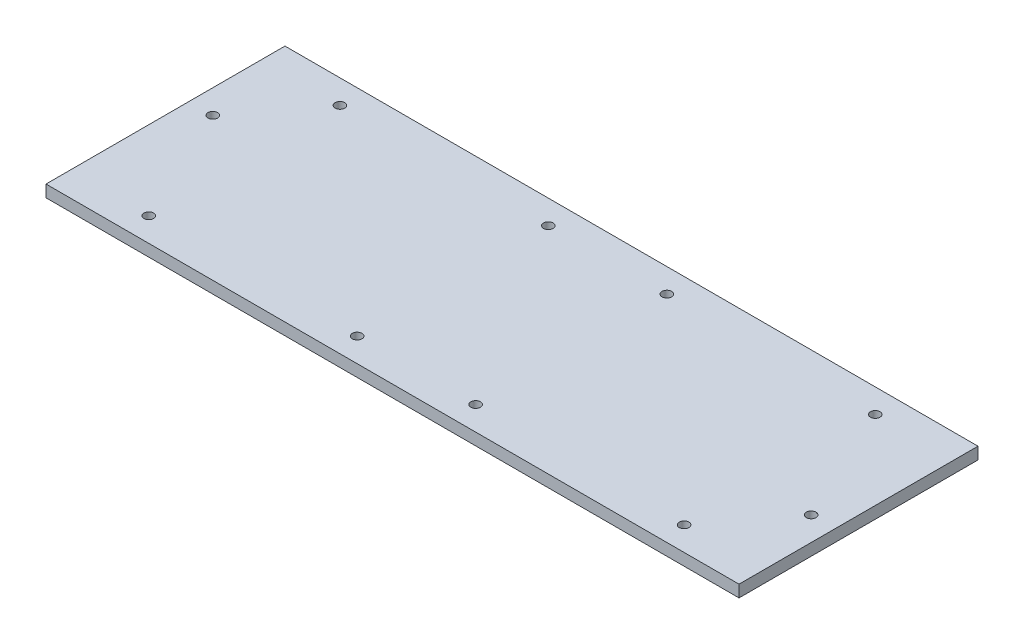
ISO-10303-21;
HEADER;
FILE_DESCRIPTION(('STEP AP214'),'2;1');
FILE_NAME('part.step','',(''),(''),'','','');
FILE_SCHEMA(('AUTOMOTIVE_DESIGN { 1 0 10303 214 1 1 1 1 }'));
ENDSEC;
DATA;
#1=APPLICATION_CONTEXT('core data for automotive mechanical design processes');
#2=APPLICATION_PROTOCOL_DEFINITION('international standard','automotive_design',2000,#1);
#3=PRODUCT_CONTEXT('',#1,'mechanical');
#4=PRODUCT('Part','Part','',(#3));
#5=PRODUCT_RELATED_PRODUCT_CATEGORY('part','',(#4));
#6=PRODUCT_DEFINITION_FORMATION('','',#4);
#7=PRODUCT_DEFINITION_CONTEXT('part definition',#1,'design');
#8=PRODUCT_DEFINITION('design','',#6,#7);
#9=PRODUCT_DEFINITION_SHAPE('','',#8);
#10=(LENGTH_UNIT() NAMED_UNIT(*) SI_UNIT(.MILLI.,.METRE.));
#11=(NAMED_UNIT(*) PLANE_ANGLE_UNIT() SI_UNIT($,.RADIAN.));
#12=(NAMED_UNIT(*) SI_UNIT($,.STERADIAN.) SOLID_ANGLE_UNIT());
#13=UNCERTAINTY_MEASURE_WITH_UNIT(LENGTH_MEASURE(1.E-05),#10,'distance_accuracy_value','');
#14=(GEOMETRIC_REPRESENTATION_CONTEXT(3) GLOBAL_UNCERTAINTY_ASSIGNED_CONTEXT((#13)) GLOBAL_UNIT_ASSIGNED_CONTEXT((#10,
#11,#12)) REPRESENTATION_CONTEXT('',''));
#15=CARTESIAN_POINT('',(0.,0.,0.));
#16=DIRECTION('',(0.,0.,1.));
#17=DIRECTION('',(1.,0.,0.));
#18=AXIS2_PLACEMENT_3D('',#15,#16,#17);
#19=CARTESIAN_POINT('',(0.,6.35,0.));
#20=DIRECTION('',(0.,-1.,0.));
#21=DIRECTION('',(0.,0.,-1.));
#22=AXIS2_PLACEMENT_3D('',#19,#20,#21);
#23=PLANE('',#22);
#24=DIRECTION('',(0.,0.,-1.));
#25=VECTOR('',#24,1.);
#26=CARTESIAN_POINT('',(368.3,6.35,-127.000000000001));
#27=LINE('',#26,#25);
#28=CARTESIAN_POINT('',(368.3,6.35,-1.27675647831893E-12));
#29=VERTEX_POINT('',#28);
#30=CARTESIAN_POINT('',(368.3,6.35,-127.000000000001));
#31=VERTEX_POINT('',#30);
#32=EDGE_CURVE('E87',#29,#31,#27,.T.);
#33=ORIENTED_EDGE('',*,*,#32,.T.);
#34=DIRECTION('',(-1.,0.,0.));
#35=VECTOR('',#34,1.);
#36=CARTESIAN_POINT('',(368.3,6.35,-127.000000000001));
#37=LINE('',#36,#35);
#38=CARTESIAN_POINT('',(-4.44089209850054E-13,6.35,-127.000000000001));
#39=VERTEX_POINT('',#38);
#40=EDGE_CURVE('E82',#31,#39,#37,.T.);
#41=ORIENTED_EDGE('',*,*,#40,.T.);
#42=DIRECTION('',(0.,0.,1.));
#43=VECTOR('',#42,1.);
#44=CARTESIAN_POINT('',(-4.44089209850054E-13,6.35,-127.000000000001));
#45=LINE('',#44,#43);
#46=CARTESIAN_POINT('',(4.44089209850063E-13,6.35,1.30451205393456E-12));
#47=VERTEX_POINT('',#46);
#48=EDGE_CURVE('E85',#39,#47,#45,.T.);
#49=ORIENTED_EDGE('',*,*,#48,.T.);
#50=DIRECTION('',(1.,0.,0.));
#51=VECTOR('',#50,1.);
#52=CARTESIAN_POINT('',(368.3,6.35,-1.27675647831893E-12));
#53=LINE('',#52,#51);
#54=EDGE_CURVE('E52',#47,#29,#53,.T.);
#55=ORIENTED_EDGE('',*,*,#54,.T.);
#56=EDGE_LOOP('',(#33,#41,#49,#55));
#57=FACE_BOUND('',#56,.T.);
#58=CARTESIAN_POINT('',(326.39,6.35,-12.700000000001));
#59=DIRECTION('',(0.,1.,0.));
#60=DIRECTION('',(0.,0.,1.));
#61=AXIS2_PLACEMENT_3D('',#58,#59,#60);
#62=CIRCLE('',#61,2.5527);
#63=CARTESIAN_POINT('',(326.39,6.35,-10.147300000001));
#64=VERTEX_POINT('',#63);
#65=EDGE_CURVE('E102',#64,#64,#62,.T.);
#66=ORIENTED_EDGE('',*,*,#65,.F.);
#67=EDGE_LOOP('',(#66));
#68=FACE_BOUND('',#67,.T.);
#69=CARTESIAN_POINT('',(41.9100000000004,6.35,-12.699999999999));
#70=DIRECTION('',(0.,1.,0.));
#71=DIRECTION('',(0.,0.,1.));
#72=AXIS2_PLACEMENT_3D('',#69,#70,#71);
#73=CIRCLE('',#72,2.5527);
#74=CARTESIAN_POINT('',(41.9100000000004,6.35,-10.147299999999));
#75=VERTEX_POINT('',#74);
#76=EDGE_CURVE('E117',#75,#75,#73,.T.);
#77=ORIENTED_EDGE('',*,*,#76,.F.);
#78=EDGE_LOOP('',(#77));
#79=FACE_BOUND('',#78,.T.);
#80=CARTESIAN_POINT('',(215.646,6.35,-12.7000000000002));
#81=DIRECTION('',(0.,1.,0.));
#82=DIRECTION('',(0.,0.,1.));
#83=AXIS2_PLACEMENT_3D('',#80,#81,#82);
#84=CIRCLE('',#83,2.55270000000002);
#85=CARTESIAN_POINT('',(215.646,6.35,-10.1473000000002));
#86=VERTEX_POINT('',#85);
#87=EDGE_CURVE('E123',#86,#86,#84,.T.);
#88=ORIENTED_EDGE('',*,*,#87,.F.);
#89=EDGE_LOOP('',(#88));
#90=FACE_BOUND('',#89,.T.);
#91=CARTESIAN_POINT('',(152.654,6.35,-12.6999999999998));
#92=DIRECTION('',(0.,1.,0.));
#93=DIRECTION('',(0.,0.,1.));
#94=AXIS2_PLACEMENT_3D('',#91,#92,#93);
#95=CIRCLE('',#94,2.55270000000005);
#96=CARTESIAN_POINT('',(152.654,6.35,-10.1472999999997));
#97=VERTEX_POINT('',#96);
#98=EDGE_CURVE('E129',#97,#97,#95,.T.);
#99=ORIENTED_EDGE('',*,*,#98,.F.);
#100=EDGE_LOOP('',(#99));
#101=FACE_BOUND('',#100,.T.);
#102=CARTESIAN_POINT('',(215.646,6.35,-114.300000000001));
#103=DIRECTION('',(0.,1.,0.));
#104=DIRECTION('',(0.,0.,1.));
#105=AXIS2_PLACEMENT_3D('',#102,#103,#104);
#106=CIRCLE('',#105,2.55270000000075);
#107=CARTESIAN_POINT('',(215.646,6.35,-111.747300000001));
#108=VERTEX_POINT('',#107);
#109=EDGE_CURVE('E135',#108,#108,#106,.T.);
#110=ORIENTED_EDGE('',*,*,#109,.F.);
#111=EDGE_LOOP('',(#110));
#112=FACE_BOUND('',#111,.T.);
#113=CARTESIAN_POINT('',(41.9099999999996,6.35,-114.3));
#114=DIRECTION('',(0.,1.,0.));
#115=DIRECTION('',(0.,0.,1.));
#116=AXIS2_PLACEMENT_3D('',#113,#114,#115);
#117=CIRCLE('',#116,2.5527000000003);
#118=CARTESIAN_POINT('',(41.9099999999996,6.35,-111.7473));
#119=VERTEX_POINT('',#118);
#120=EDGE_CURVE('E141',#119,#119,#117,.T.);
#121=ORIENTED_EDGE('',*,*,#120,.F.);
#122=EDGE_LOOP('',(#121));
#123=FACE_BOUND('',#122,.T.);
#124=CARTESIAN_POINT('',(326.39,6.35,-114.300000000002));
#125=DIRECTION('',(0.,1.,0.));
#126=DIRECTION('',(0.,0.,1.));
#127=AXIS2_PLACEMENT_3D('',#124,#125,#126);
#128=CIRCLE('',#127,2.55270000000072);
#129=CARTESIAN_POINT('',(326.39,6.35,-111.747300000002));
#130=VERTEX_POINT('',#129);
#131=EDGE_CURVE('E147',#130,#130,#128,.T.);
#132=ORIENTED_EDGE('',*,*,#131,.F.);
#133=EDGE_LOOP('',(#132));
#134=FACE_BOUND('',#133,.T.);
#135=CARTESIAN_POINT('',(152.654,6.35,-114.300000000001));
#136=DIRECTION('',(0.,1.,0.));
#137=DIRECTION('',(0.,0.,1.));
#138=AXIS2_PLACEMENT_3D('',#135,#136,#137);
#139=CIRCLE('',#138,2.5527000000004);
#140=CARTESIAN_POINT('',(152.654,6.35,-111.747300000001));
#141=VERTEX_POINT('',#140);
#142=EDGE_CURVE('E153',#141,#141,#139,.T.);
#143=ORIENTED_EDGE('',*,*,#142,.F.);
#144=EDGE_LOOP('',(#143));
#145=FACE_BOUND('',#144,.T.);
#146=CARTESIAN_POINT('',(12.7000000000001,6.35,-75.9460000000007));
#147=DIRECTION('',(0.,1.,0.));
#148=DIRECTION('',(0.,0.,1.));
#149=AXIS2_PLACEMENT_3D('',#146,#147,#148);
#150=CIRCLE('',#149,2.55270000000064);
#151=CARTESIAN_POINT('',(12.7000000000001,6.35,-73.3933));
#152=VERTEX_POINT('',#151);
#153=EDGE_CURVE('E159',#152,#152,#150,.T.);
#154=ORIENTED_EDGE('',*,*,#153,.F.);
#155=EDGE_LOOP('',(#154));
#156=FACE_BOUND('',#155,.T.);
#157=CARTESIAN_POINT('',(355.6,6.35,-51.0540000000012));
#158=DIRECTION('',(0.,1.,0.));
#159=DIRECTION('',(0.,0.,1.));
#160=AXIS2_PLACEMENT_3D('',#157,#158,#159);
#161=CIRCLE('',#160,2.55270000000021);
#162=CARTESIAN_POINT('',(355.6,6.35,-48.501300000001));
#163=VERTEX_POINT('',#162);
#164=EDGE_CURVE('E165',#163,#163,#161,.T.);
#165=ORIENTED_EDGE('',*,*,#164,.F.);
#166=EDGE_LOOP('',(#165));
#167=FACE_BOUND('',#166,.T.);
#168=ADVANCED_FACE('F35',(#57,#68,#79,#90,#101,#112,#123,#134,#145,#156,#167),#23,.F.);
#169=CARTESIAN_POINT('',(0.,0.,0.));
#170=DIRECTION('',(0.,-1.,0.));
#171=DIRECTION('',(0.,0.,-1.));
#172=AXIS2_PLACEMENT_3D('',#169,#170,#171);
#173=PLANE('',#172);
#174=CARTESIAN_POINT('',(12.7000000000001,0.,-75.9460000000007));
#175=DIRECTION('',(0.,1.,0.));
#176=DIRECTION('',(0.,0.,1.));
#177=AXIS2_PLACEMENT_3D('',#174,#175,#176);
#178=CIRCLE('',#177,2.55270000000064);
#179=CARTESIAN_POINT('',(12.7000000000001,0.,-73.3933));
#180=VERTEX_POINT('',#179);
#181=EDGE_CURVE('E162',#180,#180,#178,.T.);
#182=ORIENTED_EDGE('',*,*,#181,.T.);
#183=EDGE_LOOP('',(#182));
#184=FACE_BOUND('',#183,.T.);
#185=CARTESIAN_POINT('',(326.39,0.,-114.300000000002));
#186=DIRECTION('',(0.,1.,0.));
#187=DIRECTION('',(0.,0.,1.));
#188=AXIS2_PLACEMENT_3D('',#185,#186,#187);
#189=CIRCLE('',#188,2.55270000000072);
#190=CARTESIAN_POINT('',(326.39,0.,-111.747300000002));
#191=VERTEX_POINT('',#190);
#192=EDGE_CURVE('E150',#191,#191,#189,.T.);
#193=ORIENTED_EDGE('',*,*,#192,.T.);
#194=EDGE_LOOP('',(#193));
#195=FACE_BOUND('',#194,.T.);
#196=CARTESIAN_POINT('',(215.646,0.,-114.300000000001));
#197=DIRECTION('',(0.,1.,0.));
#198=DIRECTION('',(0.,0.,1.));
#199=AXIS2_PLACEMENT_3D('',#196,#197,#198);
#200=CIRCLE('',#199,2.55270000000075);
#201=CARTESIAN_POINT('',(215.646,0.,-111.747300000001));
#202=VERTEX_POINT('',#201);
#203=EDGE_CURVE('E138',#202,#202,#200,.T.);
#204=ORIENTED_EDGE('',*,*,#203,.T.);
#205=EDGE_LOOP('',(#204));
#206=FACE_BOUND('',#205,.T.);
#207=CARTESIAN_POINT('',(215.646,0.,-12.7000000000002));
#208=DIRECTION('',(0.,1.,0.));
#209=DIRECTION('',(0.,0.,1.));
#210=AXIS2_PLACEMENT_3D('',#207,#208,#209);
#211=CIRCLE('',#210,2.55270000000002);
#212=CARTESIAN_POINT('',(215.646,0.,-10.1473000000002));
#213=VERTEX_POINT('',#212);
#214=EDGE_CURVE('E126',#213,#213,#211,.T.);
#215=ORIENTED_EDGE('',*,*,#214,.T.);
#216=EDGE_LOOP('',(#215));
#217=FACE_BOUND('',#216,.T.);
#218=CARTESIAN_POINT('',(326.39,0.,-12.700000000001));
#219=DIRECTION('',(0.,1.,0.));
#220=DIRECTION('',(0.,0.,1.));
#221=AXIS2_PLACEMENT_3D('',#218,#219,#220);
#222=CIRCLE('',#221,2.5527);
#223=CARTESIAN_POINT('',(326.39,0.,-10.147300000001));
#224=VERTEX_POINT('',#223);
#225=EDGE_CURVE('E114',#224,#224,#222,.T.);
#226=ORIENTED_EDGE('',*,*,#225,.T.);
#227=EDGE_LOOP('',(#226));
#228=FACE_BOUND('',#227,.T.);
#229=DIRECTION('',(0.,0.,-1.));
#230=VECTOR('',#229,1.);
#231=CARTESIAN_POINT('',(368.3,0.,-127.000000000001));
#232=LINE('',#231,#230);
#233=CARTESIAN_POINT('',(368.3,0.,-1.27675647831893E-12));
#234=VERTEX_POINT('',#233);
#235=CARTESIAN_POINT('',(368.3,0.,-127.000000000001));
#236=VERTEX_POINT('',#235);
#237=EDGE_CURVE('E99',#234,#236,#232,.T.);
#238=ORIENTED_EDGE('',*,*,#237,.F.);
#239=DIRECTION('',(1.,0.,0.));
#240=VECTOR('',#239,1.);
#241=CARTESIAN_POINT('',(368.3,0.,-1.27675647831893E-12));
#242=LINE('',#241,#240);
#243=CARTESIAN_POINT('',(4.44089209850063E-13,0.,1.30451205393456E-12));
#244=VERTEX_POINT('',#243);
#245=EDGE_CURVE('E75',#244,#234,#242,.T.);
#246=ORIENTED_EDGE('',*,*,#245,.F.);
#247=DIRECTION('',(0.,0.,1.));
#248=VECTOR('',#247,1.);
#249=CARTESIAN_POINT('',(-4.44089209850054E-13,0.,-127.000000000001));
#250=LINE('',#249,#248);
#251=CARTESIAN_POINT('',(-4.44089209850054E-13,0.,-127.000000000001));
#252=VERTEX_POINT('',#251);
#253=EDGE_CURVE('E69',#252,#244,#250,.T.);
#254=ORIENTED_EDGE('',*,*,#253,.F.);
#255=DIRECTION('',(-1.,0.,0.));
#256=VECTOR('',#255,1.);
#257=CARTESIAN_POINT('',(368.3,0.,-127.000000000001));
#258=LINE('',#257,#256);
#259=EDGE_CURVE('E91',#236,#252,#258,.T.);
#260=ORIENTED_EDGE('',*,*,#259,.F.);
#261=EDGE_LOOP('',(#238,#246,#254,#260));
#262=FACE_BOUND('',#261,.T.);
#263=CARTESIAN_POINT('',(41.9100000000004,0.,-12.699999999999));
#264=DIRECTION('',(0.,1.,0.));
#265=DIRECTION('',(0.,0.,1.));
#266=AXIS2_PLACEMENT_3D('',#263,#264,#265);
#267=CIRCLE('',#266,2.5527);
#268=CARTESIAN_POINT('',(41.9100000000004,0.,-10.147299999999));
#269=VERTEX_POINT('',#268);
#270=EDGE_CURVE('E120',#269,#269,#267,.T.);
#271=ORIENTED_EDGE('',*,*,#270,.T.);
#272=EDGE_LOOP('',(#271));
#273=FACE_BOUND('',#272,.T.);
#274=CARTESIAN_POINT('',(152.654,0.,-12.6999999999998));
#275=DIRECTION('',(0.,1.,0.));
#276=DIRECTION('',(0.,0.,1.));
#277=AXIS2_PLACEMENT_3D('',#274,#275,#276);
#278=CIRCLE('',#277,2.55270000000005);
#279=CARTESIAN_POINT('',(152.654,0.,-10.1472999999997));
#280=VERTEX_POINT('',#279);
#281=EDGE_CURVE('E132',#280,#280,#278,.T.);
#282=ORIENTED_EDGE('',*,*,#281,.T.);
#283=EDGE_LOOP('',(#282));
#284=FACE_BOUND('',#283,.T.);
#285=CARTESIAN_POINT('',(41.9099999999996,0.,-114.3));
#286=DIRECTION('',(0.,1.,0.));
#287=DIRECTION('',(0.,0.,1.));
#288=AXIS2_PLACEMENT_3D('',#285,#286,#287);
#289=CIRCLE('',#288,2.5527000000003);
#290=CARTESIAN_POINT('',(41.9099999999996,0.,-111.7473));
#291=VERTEX_POINT('',#290);
#292=EDGE_CURVE('E144',#291,#291,#289,.T.);
#293=ORIENTED_EDGE('',*,*,#292,.T.);
#294=EDGE_LOOP('',(#293));
#295=FACE_BOUND('',#294,.T.);
#296=CARTESIAN_POINT('',(152.654,0.,-114.300000000001));
#297=DIRECTION('',(0.,1.,0.));
#298=DIRECTION('',(0.,0.,1.));
#299=AXIS2_PLACEMENT_3D('',#296,#297,#298);
#300=CIRCLE('',#299,2.5527000000004);
#301=CARTESIAN_POINT('',(152.654,0.,-111.747300000001));
#302=VERTEX_POINT('',#301);
#303=EDGE_CURVE('E156',#302,#302,#300,.T.);
#304=ORIENTED_EDGE('',*,*,#303,.T.);
#305=EDGE_LOOP('',(#304));
#306=FACE_BOUND('',#305,.T.);
#307=CARTESIAN_POINT('',(355.6,0.,-51.0540000000012));
#308=DIRECTION('',(0.,1.,0.));
#309=DIRECTION('',(0.,0.,1.));
#310=AXIS2_PLACEMENT_3D('',#307,#308,#309);
#311=CIRCLE('',#310,2.55270000000021);
#312=CARTESIAN_POINT('',(355.6,0.,-48.501300000001));
#313=VERTEX_POINT('',#312);
#314=EDGE_CURVE('E168',#313,#313,#311,.T.);
#315=ORIENTED_EDGE('',*,*,#314,.T.);
#316=EDGE_LOOP('',(#315));
#317=FACE_BOUND('',#316,.T.);
#318=ADVANCED_FACE('F110',(#184,#195,#206,#217,#228,#262,#273,#284,#295,#306,#317),#173,.T.);
#319=CARTESIAN_POINT('',(368.3,6.35,-127.000000000001));
#320=DIRECTION('',(-1.,0.,0.));
#321=DIRECTION('',(0.,0.,1.));
#322=AXIS2_PLACEMENT_3D('',#319,#320,#321);
#323=PLANE('',#322);
#324=ORIENTED_EDGE('',*,*,#237,.T.);
#325=DIRECTION('',(0.,-1.,0.));
#326=VECTOR('',#325,1.);
#327=CARTESIAN_POINT('',(368.3,6.35,-127.000000000001));
#328=LINE('',#327,#326);
#329=EDGE_CURVE('E11',#31,#236,#328,.T.);
#330=ORIENTED_EDGE('',*,*,#329,.F.);
#331=ORIENTED_EDGE('',*,*,#32,.F.);
#332=DIRECTION('',(0.,-1.,0.));
#333=VECTOR('',#332,1.);
#334=CARTESIAN_POINT('',(368.3,6.35,-1.27675647831893E-12));
#335=LINE('',#334,#333);
#336=EDGE_CURVE('E95',#29,#234,#335,.T.);
#337=ORIENTED_EDGE('',*,*,#336,.T.);
#338=EDGE_LOOP('',(#324,#330,#331,#337));
#339=FACE_BOUND('',#338,.T.);
#340=ADVANCED_FACE('F37',(#339),#323,.F.);
#341=CARTESIAN_POINT('',(368.3,6.35,-127.000000000001));
#342=DIRECTION('',(0.,0.,1.));
#343=DIRECTION('',(1.,0.,0.));
#344=AXIS2_PLACEMENT_3D('',#341,#342,#343);
#345=PLANE('',#344);
#346=ORIENTED_EDGE('',*,*,#259,.T.);
#347=DIRECTION('',(0.,-1.,0.));
#348=VECTOR('',#347,1.);
#349=CARTESIAN_POINT('',(-4.44089209850054E-13,6.35,-127.000000000001));
#350=LINE('',#349,#348);
#351=EDGE_CURVE('E44',#39,#252,#350,.T.);
#352=ORIENTED_EDGE('',*,*,#351,.F.);
#353=ORIENTED_EDGE('',*,*,#40,.F.);
#354=ORIENTED_EDGE('',*,*,#329,.T.);
#355=EDGE_LOOP('',(#346,#352,#353,#354));
#356=FACE_BOUND('',#355,.T.);
#357=ADVANCED_FACE('F90',(#356),#345,.F.);
#358=CARTESIAN_POINT('',(-4.44089209850054E-13,6.35,-127.000000000001));
#359=DIRECTION('',(1.,0.,0.));
#360=DIRECTION('',(0.,0.,-1.));
#361=AXIS2_PLACEMENT_3D('',#358,#359,#360);
#362=PLANE('',#361);
#363=ORIENTED_EDGE('',*,*,#253,.T.);
#364=DIRECTION('',(0.,-1.,0.));
#365=VECTOR('',#364,1.);
#366=CARTESIAN_POINT('',(4.44089209850063E-13,6.35,1.30451205393456E-12));
#367=LINE('',#366,#365);
#368=EDGE_CURVE('E92',#47,#244,#367,.T.);
#369=ORIENTED_EDGE('',*,*,#368,.F.);
#370=ORIENTED_EDGE('',*,*,#48,.F.);
#371=ORIENTED_EDGE('',*,*,#351,.T.);
#372=EDGE_LOOP('',(#363,#369,#370,#371));
#373=FACE_BOUND('',#372,.T.);
#374=ADVANCED_FACE('F93',(#373),#362,.F.);
#375=CARTESIAN_POINT('',(368.3,6.35,-1.27675647831893E-12));
#376=DIRECTION('',(0.,0.,-1.));
#377=DIRECTION('',(-1.,0.,0.));
#378=AXIS2_PLACEMENT_3D('',#375,#376,#377);
#379=PLANE('',#378);
#380=ORIENTED_EDGE('',*,*,#245,.T.);
#381=ORIENTED_EDGE('',*,*,#336,.F.);
#382=ORIENTED_EDGE('',*,*,#54,.F.);
#383=ORIENTED_EDGE('',*,*,#368,.T.);
#384=EDGE_LOOP('',(#380,#381,#382,#383));
#385=FACE_BOUND('',#384,.T.);
#386=ADVANCED_FACE('F107',(#385),#379,.F.);
#387=CARTESIAN_POINT('',(326.39,6.35,-12.700000000001));
#388=DIRECTION('',(0.,-1.,0.));
#389=DIRECTION('',(0.,0.,-1.));
#390=AXIS2_PLACEMENT_3D('',#387,#388,#389);
#391=CYLINDRICAL_SURFACE('',#390,2.5527);
#392=ORIENTED_EDGE('',*,*,#65,.T.);
#393=EDGE_LOOP('',(#392));
#394=FACE_BOUND('',#393,.T.);
#395=ORIENTED_EDGE('',*,*,#225,.F.);
#396=EDGE_LOOP('',(#395));
#397=FACE_BOUND('',#396,.T.);
#398=ADVANCED_FACE('F185',(#394,#397),#391,.F.);
#399=CARTESIAN_POINT('',(41.9100000000004,6.35,-12.699999999999));
#400=DIRECTION('',(0.,-1.,0.));
#401=DIRECTION('',(0.,0.,-1.));
#402=AXIS2_PLACEMENT_3D('',#399,#400,#401);
#403=CYLINDRICAL_SURFACE('',#402,2.5527);
#404=ORIENTED_EDGE('',*,*,#76,.T.);
#405=EDGE_LOOP('',(#404));
#406=FACE_BOUND('',#405,.T.);
#407=ORIENTED_EDGE('',*,*,#270,.F.);
#408=EDGE_LOOP('',(#407));
#409=FACE_BOUND('',#408,.T.);
#410=ADVANCED_FACE('F231',(#406,#409),#403,.F.);
#411=CARTESIAN_POINT('',(215.646,6.35,-12.7000000000002));
#412=DIRECTION('',(0.,-1.,0.));
#413=DIRECTION('',(0.,0.,-1.));
#414=AXIS2_PLACEMENT_3D('',#411,#412,#413);
#415=CYLINDRICAL_SURFACE('',#414,2.55270000000002);
#416=ORIENTED_EDGE('',*,*,#87,.T.);
#417=EDGE_LOOP('',(#416));
#418=FACE_BOUND('',#417,.T.);
#419=ORIENTED_EDGE('',*,*,#214,.F.);
#420=EDGE_LOOP('',(#419));
#421=FACE_BOUND('',#420,.T.);
#422=ADVANCED_FACE('F239',(#418,#421),#415,.F.);
#423=CARTESIAN_POINT('',(152.654,6.35,-12.6999999999998));
#424=DIRECTION('',(0.,-1.,0.));
#425=DIRECTION('',(0.,0.,-1.));
#426=AXIS2_PLACEMENT_3D('',#423,#424,#425);
#427=CYLINDRICAL_SURFACE('',#426,2.55270000000005);
#428=ORIENTED_EDGE('',*,*,#98,.T.);
#429=EDGE_LOOP('',(#428));
#430=FACE_BOUND('',#429,.T.);
#431=ORIENTED_EDGE('',*,*,#281,.F.);
#432=EDGE_LOOP('',(#431));
#433=FACE_BOUND('',#432,.T.);
#434=ADVANCED_FACE('F247',(#430,#433),#427,.F.);
#435=CARTESIAN_POINT('',(215.646,6.35,-114.300000000001));
#436=DIRECTION('',(0.,-1.,0.));
#437=DIRECTION('',(0.,0.,-1.));
#438=AXIS2_PLACEMENT_3D('',#435,#436,#437);
#439=CYLINDRICAL_SURFACE('',#438,2.55270000000075);
#440=ORIENTED_EDGE('',*,*,#109,.T.);
#441=EDGE_LOOP('',(#440));
#442=FACE_BOUND('',#441,.T.);
#443=ORIENTED_EDGE('',*,*,#203,.F.);
#444=EDGE_LOOP('',(#443));
#445=FACE_BOUND('',#444,.T.);
#446=ADVANCED_FACE('F256',(#442,#445),#439,.F.);
#447=CARTESIAN_POINT('',(41.9099999999996,6.35,-114.3));
#448=DIRECTION('',(0.,-1.,0.));
#449=DIRECTION('',(0.,0.,-1.));
#450=AXIS2_PLACEMENT_3D('',#447,#448,#449);
#451=CYLINDRICAL_SURFACE('',#450,2.5527000000003);
#452=ORIENTED_EDGE('',*,*,#120,.T.);
#453=EDGE_LOOP('',(#452));
#454=FACE_BOUND('',#453,.T.);
#455=ORIENTED_EDGE('',*,*,#292,.F.);
#456=EDGE_LOOP('',(#455));
#457=FACE_BOUND('',#456,.T.);
#458=ADVANCED_FACE('F265',(#454,#457),#451,.F.);
#459=CARTESIAN_POINT('',(326.39,6.35,-114.300000000002));
#460=DIRECTION('',(0.,-1.,0.));
#461=DIRECTION('',(0.,0.,-1.));
#462=AXIS2_PLACEMENT_3D('',#459,#460,#461);
#463=CYLINDRICAL_SURFACE('',#462,2.55270000000072);
#464=ORIENTED_EDGE('',*,*,#131,.T.);
#465=EDGE_LOOP('',(#464));
#466=FACE_BOUND('',#465,.T.);
#467=ORIENTED_EDGE('',*,*,#192,.F.);
#468=EDGE_LOOP('',(#467));
#469=FACE_BOUND('',#468,.T.);
#470=ADVANCED_FACE('F274',(#466,#469),#463,.F.);
#471=CARTESIAN_POINT('',(152.654,6.35,-114.300000000001));
#472=DIRECTION('',(0.,-1.,0.));
#473=DIRECTION('',(0.,0.,-1.));
#474=AXIS2_PLACEMENT_3D('',#471,#472,#473);
#475=CYLINDRICAL_SURFACE('',#474,2.5527000000004);
#476=ORIENTED_EDGE('',*,*,#142,.T.);
#477=EDGE_LOOP('',(#476));
#478=FACE_BOUND('',#477,.T.);
#479=ORIENTED_EDGE('',*,*,#303,.F.);
#480=EDGE_LOOP('',(#479));
#481=FACE_BOUND('',#480,.T.);
#482=ADVANCED_FACE('F283',(#478,#481),#475,.F.);
#483=CARTESIAN_POINT('',(12.7000000000001,6.35,-75.9460000000007));
#484=DIRECTION('',(0.,-1.,0.));
#485=DIRECTION('',(0.,0.,-1.));
#486=AXIS2_PLACEMENT_3D('',#483,#484,#485);
#487=CYLINDRICAL_SURFACE('',#486,2.55270000000064);
#488=ORIENTED_EDGE('',*,*,#153,.T.);
#489=EDGE_LOOP('',(#488));
#490=FACE_BOUND('',#489,.T.);
#491=ORIENTED_EDGE('',*,*,#181,.F.);
#492=EDGE_LOOP('',(#491));
#493=FACE_BOUND('',#492,.T.);
#494=ADVANCED_FACE('F292',(#490,#493),#487,.F.);
#495=CARTESIAN_POINT('',(355.6,6.35,-51.0540000000012));
#496=DIRECTION('',(0.,-1.,0.));
#497=DIRECTION('',(0.,0.,-1.));
#498=AXIS2_PLACEMENT_3D('',#495,#496,#497);
#499=CYLINDRICAL_SURFACE('',#498,2.55270000000021);
#500=ORIENTED_EDGE('',*,*,#164,.T.);
#501=EDGE_LOOP('',(#500));
#502=FACE_BOUND('',#501,.T.);
#503=ORIENTED_EDGE('',*,*,#314,.F.);
#504=EDGE_LOOP('',(#503));
#505=FACE_BOUND('',#504,.T.);
#506=ADVANCED_FACE('F174',(#502,#505),#499,.F.);
#507=CLOSED_SHELL('',(#168,#318,#340,#357,#374,#386,#398,#410,#422,#434,#446,#458,#470,#482,
#494,#506));
#508=MANIFOLD_SOLID_BREP('B2',#507);
#509=ADVANCED_BREP_SHAPE_REPRESENTATION('',(#18,#508),#14);
#510=SHAPE_DEFINITION_REPRESENTATION(#9,#509);
ENDSEC;
END-ISO-10303-21;
